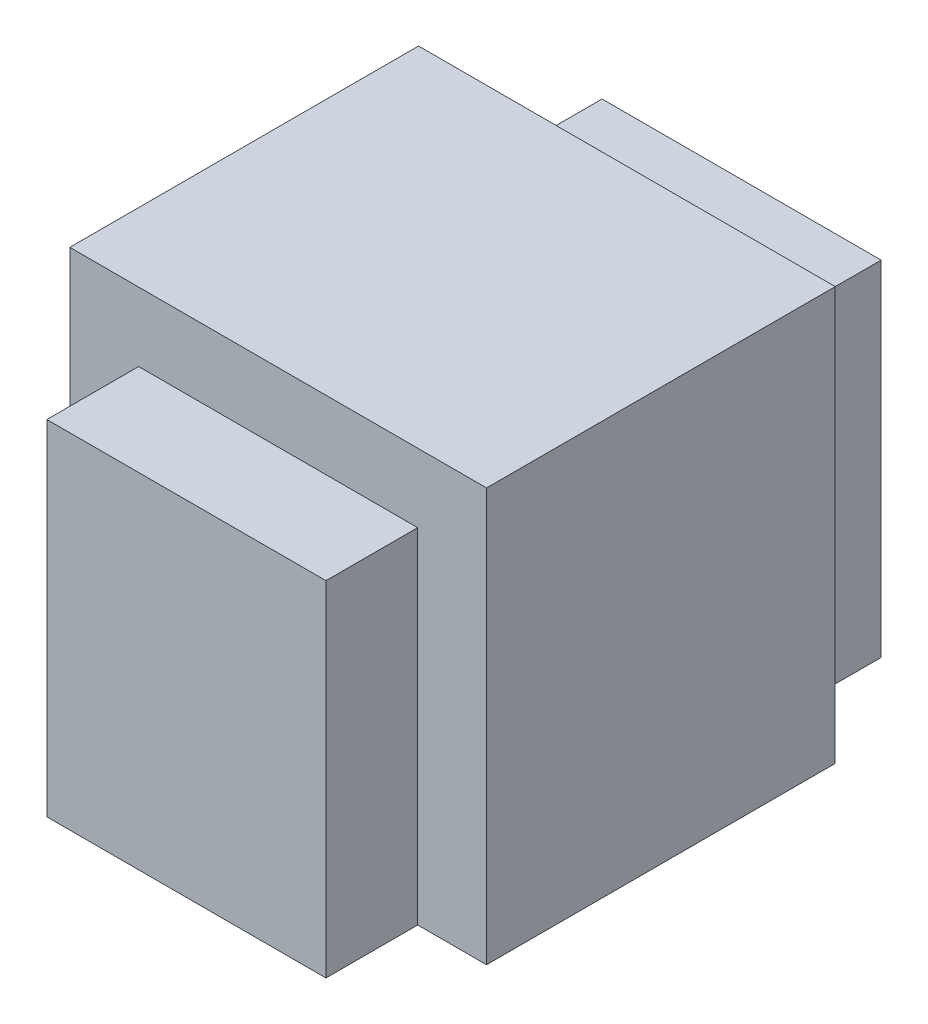
ISO-10303-21;
HEADER;
FILE_DESCRIPTION(('STEP AP214'),'2;1');
FILE_NAME('part.step','',(''),(''),'','','');
FILE_SCHEMA(('AUTOMOTIVE_DESIGN { 1 0 10303 214 1 1 1 1 }'));
ENDSEC;
DATA;
#1=APPLICATION_CONTEXT('core data for automotive mechanical design processes');
#2=APPLICATION_PROTOCOL_DEFINITION('international standard','automotive_design',2000,#1);
#3=PRODUCT_CONTEXT('',#1,'mechanical');
#4=PRODUCT('Part','Part','',(#3));
#5=PRODUCT_RELATED_PRODUCT_CATEGORY('part','',(#4));
#6=PRODUCT_DEFINITION_FORMATION('','',#4);
#7=PRODUCT_DEFINITION_CONTEXT('part definition',#1,'design');
#8=PRODUCT_DEFINITION('design','',#6,#7);
#9=PRODUCT_DEFINITION_SHAPE('','',#8);
#10=(LENGTH_UNIT() NAMED_UNIT(*) SI_UNIT(.MILLI.,.METRE.));
#11=(NAMED_UNIT(*) PLANE_ANGLE_UNIT() SI_UNIT($,.RADIAN.));
#12=(NAMED_UNIT(*) SI_UNIT($,.STERADIAN.) SOLID_ANGLE_UNIT());
#13=UNCERTAINTY_MEASURE_WITH_UNIT(LENGTH_MEASURE(1.E-05),#10,'distance_accuracy_value','');
#14=(GEOMETRIC_REPRESENTATION_CONTEXT(3) GLOBAL_UNCERTAINTY_ASSIGNED_CONTEXT((#13)) GLOBAL_UNIT_ASSIGNED_CONTEXT((#10,
#11,#12)) REPRESENTATION_CONTEXT('',''));
#15=CARTESIAN_POINT('',(0.,0.,0.));
#16=DIRECTION('',(0.,0.,1.));
#17=DIRECTION('',(1.,0.,0.));
#18=AXIS2_PLACEMENT_3D('',#15,#16,#17);
#19=CARTESIAN_POINT('',(0.,0.,76.));
#20=DIRECTION('',(0.,0.,-1.));
#21=DIRECTION('',(-1.,0.,0.));
#22=AXIS2_PLACEMENT_3D('',#19,#20,#21);
#23=PLANE('',#22);
#24=DIRECTION('',(0.,-1.,0.));
#25=VECTOR('',#24,1.);
#26=CARTESIAN_POINT('',(15.,0.,76.));
#27=LINE('',#26,#25);
#28=CARTESIAN_POINT('',(15.,75.,76.));
#29=VERTEX_POINT('',#28);
#30=CARTESIAN_POINT('',(15.,0.,76.));
#31=VERTEX_POINT('',#30);
#32=EDGE_CURVE('E143',#29,#31,#27,.T.);
#33=ORIENTED_EDGE('',*,*,#32,.F.);
#34=DIRECTION('',(-1.,0.,0.));
#35=VECTOR('',#34,1.);
#36=CARTESIAN_POINT('',(15.,75.,76.));
#37=LINE('',#36,#35);
#38=CARTESIAN_POINT('',(75.825,75.,76.));
#39=VERTEX_POINT('',#38);
#40=EDGE_CURVE('E156',#39,#29,#37,.T.);
#41=ORIENTED_EDGE('',*,*,#40,.F.);
#42=DIRECTION('',(0.,1.,0.));
#43=VECTOR('',#42,1.);
#44=CARTESIAN_POINT('',(75.825,0.,76.));
#45=LINE('',#44,#43);
#46=CARTESIAN_POINT('',(75.825,0.,76.));
#47=VERTEX_POINT('',#46);
#48=EDGE_CURVE('E146',#47,#39,#45,.T.);
#49=ORIENTED_EDGE('',*,*,#48,.F.);
#50=DIRECTION('',(1.,0.,0.));
#51=VECTOR('',#50,1.);
#52=CARTESIAN_POINT('',(0.,0.,76.));
#53=LINE('',#52,#51);
#54=CARTESIAN_POINT('',(90.825,0.,76.));
#55=VERTEX_POINT('',#54);
#56=EDGE_CURVE('E182',#47,#55,#53,.T.);
#57=ORIENTED_EDGE('',*,*,#56,.T.);
#58=DIRECTION('',(0.,1.,0.));
#59=VECTOR('',#58,1.);
#60=CARTESIAN_POINT('',(90.825,0.,76.));
#61=LINE('',#60,#59);
#62=CARTESIAN_POINT('',(90.825,90.,76.));
#63=VERTEX_POINT('',#62);
#64=EDGE_CURVE('E186',#55,#63,#61,.T.);
#65=ORIENTED_EDGE('',*,*,#64,.T.);
#66=DIRECTION('',(-1.,0.,0.));
#67=VECTOR('',#66,1.);
#68=CARTESIAN_POINT('',(0.,90.,76.));
#69=LINE('',#68,#67);
#70=CARTESIAN_POINT('',(0.,90.,76.));
#71=VERTEX_POINT('',#70);
#72=EDGE_CURVE('E188',#63,#71,#69,.T.);
#73=ORIENTED_EDGE('',*,*,#72,.T.);
#74=DIRECTION('',(0.,-1.,0.));
#75=VECTOR('',#74,1.);
#76=CARTESIAN_POINT('',(0.,0.,76.));
#77=LINE('',#76,#75);
#78=CARTESIAN_POINT('',(0.,0.,76.));
#79=VERTEX_POINT('',#78);
#80=EDGE_CURVE('E179',#71,#79,#77,.T.);
#81=ORIENTED_EDGE('',*,*,#80,.T.);
#82=EDGE_CURVE('E184',#79,#31,#53,.T.);
#83=ORIENTED_EDGE('',*,*,#82,.T.);
#84=EDGE_LOOP('',(#33,#41,#49,#57,#65,#73,#81,#83));
#85=FACE_BOUND('',#84,.T.);
#86=ADVANCED_FACE('F34',(#85),#23,.F.);
#87=CARTESIAN_POINT('',(0.,0.,76.));
#88=DIRECTION('',(1.,0.,0.));
#89=DIRECTION('',(0.,0.,-1.));
#90=AXIS2_PLACEMENT_3D('',#87,#88,#89);
#91=PLANE('',#90);
#92=DIRECTION('',(0.,-1.,0.));
#93=VECTOR('',#92,1.);
#94=CARTESIAN_POINT('',(0.,0.,0.));
#95=LINE('',#94,#93);
#96=CARTESIAN_POINT('',(0.,90.,0.));
#97=VERTEX_POINT('',#96);
#98=CARTESIAN_POINT('',(0.,0.,0.));
#99=VERTEX_POINT('',#98);
#100=EDGE_CURVE('E178',#97,#99,#95,.T.);
#101=ORIENTED_EDGE('',*,*,#100,.T.);
#102=DIRECTION('',(0.,0.,-1.));
#103=VECTOR('',#102,1.);
#104=CARTESIAN_POINT('',(0.,0.,76.));
#105=LINE('',#104,#103);
#106=EDGE_CURVE('E11',#79,#99,#105,.T.);
#107=ORIENTED_EDGE('',*,*,#106,.F.);
#108=ORIENTED_EDGE('',*,*,#80,.F.);
#109=DIRECTION('',(0.,0.,-1.));
#110=VECTOR('',#109,1.);
#111=CARTESIAN_POINT('',(0.,90.,76.));
#112=LINE('',#111,#110);
#113=EDGE_CURVE('E190',#71,#97,#112,.T.);
#114=ORIENTED_EDGE('',*,*,#113,.T.);
#115=EDGE_LOOP('',(#101,#107,#108,#114));
#116=FACE_BOUND('',#115,.T.);
#117=ADVANCED_FACE('F36',(#116),#91,.F.);
#118=CARTESIAN_POINT('',(0.,0.,76.));
#119=DIRECTION('',(0.,1.,0.));
#120=DIRECTION('',(0.,0.,1.));
#121=AXIS2_PLACEMENT_3D('',#118,#119,#120);
#122=PLANE('',#121);
#123=DIRECTION('',(1.,0.,0.));
#124=VECTOR('',#123,1.);
#125=CARTESIAN_POINT('',(0.,0.,0.));
#126=LINE('',#125,#124);
#127=CARTESIAN_POINT('',(15.,0.,0.));
#128=VERTEX_POINT('',#127);
#129=EDGE_CURVE('E194',#99,#128,#126,.T.);
#130=ORIENTED_EDGE('',*,*,#129,.T.);
#131=DIRECTION('',(0.,0.,1.));
#132=VECTOR('',#131,1.);
#133=CARTESIAN_POINT('',(15.,0.,-25.));
#134=LINE('',#133,#132);
#135=CARTESIAN_POINT('',(15.,0.,-25.));
#136=VERTEX_POINT('',#135);
#137=EDGE_CURVE('E148',#136,#128,#134,.T.);
#138=ORIENTED_EDGE('',*,*,#137,.F.);
#139=DIRECTION('',(-1.,0.,0.));
#140=VECTOR('',#139,1.);
#141=CARTESIAN_POINT('',(75.825,0.,-25.));
#142=LINE('',#141,#140);
#143=CARTESIAN_POINT('',(75.825,0.,-25.));
#144=VERTEX_POINT('',#143);
#145=EDGE_CURVE('E130',#144,#136,#142,.T.);
#146=ORIENTED_EDGE('',*,*,#145,.F.);
#147=DIRECTION('',(0.,0.,1.));
#148=VECTOR('',#147,1.);
#149=CARTESIAN_POINT('',(75.825,0.,-25.));
#150=LINE('',#149,#148);
#151=CARTESIAN_POINT('',(75.825,0.,0.));
#152=VERTEX_POINT('',#151);
#153=EDGE_CURVE('E127',#144,#152,#150,.T.);
#154=ORIENTED_EDGE('',*,*,#153,.T.);
#155=CARTESIAN_POINT('',(90.825,0.,0.));
#156=VERTEX_POINT('',#155);
#157=EDGE_CURVE('E193',#152,#156,#126,.T.);
#158=ORIENTED_EDGE('',*,*,#157,.T.);
#159=DIRECTION('',(0.,0.,-1.));
#160=VECTOR('',#159,1.);
#161=CARTESIAN_POINT('',(90.825,0.,76.));
#162=LINE('',#161,#160);
#163=EDGE_CURVE('E42',#55,#156,#162,.T.);
#164=ORIENTED_EDGE('',*,*,#163,.F.);
#165=ORIENTED_EDGE('',*,*,#56,.F.);
#166=DIRECTION('',(0.,0.,-1.));
#167=VECTOR('',#166,1.);
#168=CARTESIAN_POINT('',(75.825,0.,96.));
#169=LINE('',#168,#167);
#170=CARTESIAN_POINT('',(75.825,0.,96.));
#171=VERTEX_POINT('',#170);
#172=EDGE_CURVE('E172',#171,#47,#169,.T.);
#173=ORIENTED_EDGE('',*,*,#172,.F.);
#174=DIRECTION('',(1.,0.,0.));
#175=VECTOR('',#174,1.);
#176=CARTESIAN_POINT('',(15.,0.,96.));
#177=LINE('',#176,#175);
#178=CARTESIAN_POINT('',(15.,0.,96.));
#179=VERTEX_POINT('',#178);
#180=EDGE_CURVE('E155',#179,#171,#177,.T.);
#181=ORIENTED_EDGE('',*,*,#180,.F.);
#182=DIRECTION('',(0.,0.,-1.));
#183=VECTOR('',#182,1.);
#184=CARTESIAN_POINT('',(15.,0.,96.));
#185=LINE('',#184,#183);
#186=EDGE_CURVE('E175',#179,#31,#185,.T.);
#187=ORIENTED_EDGE('',*,*,#186,.T.);
#188=ORIENTED_EDGE('',*,*,#82,.F.);
#189=ORIENTED_EDGE('',*,*,#106,.T.);
#190=EDGE_LOOP('',(#130,#138,#146,#154,#158,#164,#165,#173,#181,#187,#188,#189));
#191=FACE_BOUND('',#190,.T.);
#192=ADVANCED_FACE('F225',(#191),#122,.F.);
#193=CARTESIAN_POINT('',(90.825,0.,76.));
#194=DIRECTION('',(-1.,0.,0.));
#195=DIRECTION('',(0.,0.,1.));
#196=AXIS2_PLACEMENT_3D('',#193,#194,#195);
#197=PLANE('',#196);
#198=DIRECTION('',(0.,1.,0.));
#199=VECTOR('',#198,1.);
#200=CARTESIAN_POINT('',(90.825,0.,0.));
#201=LINE('',#200,#199);
#202=CARTESIAN_POINT('',(90.825,90.,0.));
#203=VERTEX_POINT('',#202);
#204=EDGE_CURVE('E197',#156,#203,#201,.T.);
#205=ORIENTED_EDGE('',*,*,#204,.T.);
#206=DIRECTION('',(0.,0.,-1.));
#207=VECTOR('',#206,1.);
#208=CARTESIAN_POINT('',(90.825,90.,76.));
#209=LINE('',#208,#207);
#210=EDGE_CURVE('E202',#63,#203,#209,.T.);
#211=ORIENTED_EDGE('',*,*,#210,.F.);
#212=ORIENTED_EDGE('',*,*,#64,.F.);
#213=ORIENTED_EDGE('',*,*,#163,.T.);
#214=EDGE_LOOP('',(#205,#211,#212,#213));
#215=FACE_BOUND('',#214,.T.);
#216=ADVANCED_FACE('F209',(#215),#197,.F.);
#217=CARTESIAN_POINT('',(0.,90.,76.));
#218=DIRECTION('',(0.,-1.,0.));
#219=DIRECTION('',(0.,0.,-1.));
#220=AXIS2_PLACEMENT_3D('',#217,#218,#219);
#221=PLANE('',#220);
#222=DIRECTION('',(-1.,0.,0.));
#223=VECTOR('',#222,1.);
#224=CARTESIAN_POINT('',(0.,90.,0.));
#225=LINE('',#224,#223);
#226=EDGE_CURVE('E183',#203,#97,#225,.T.);
#227=ORIENTED_EDGE('',*,*,#226,.T.);
#228=ORIENTED_EDGE('',*,*,#113,.F.);
#229=ORIENTED_EDGE('',*,*,#72,.F.);
#230=ORIENTED_EDGE('',*,*,#210,.T.);
#231=EDGE_LOOP('',(#227,#228,#229,#230));
#232=FACE_BOUND('',#231,.T.);
#233=ADVANCED_FACE('F218',(#232),#221,.F.);
#234=CARTESIAN_POINT('',(0.,0.,0.));
#235=DIRECTION('',(0.,0.,-1.));
#236=DIRECTION('',(-1.,0.,0.));
#237=AXIS2_PLACEMENT_3D('',#234,#235,#236);
#238=PLANE('',#237);
#239=DIRECTION('',(0.,1.,0.));
#240=VECTOR('',#239,1.);
#241=CARTESIAN_POINT('',(15.,0.,0.));
#242=LINE('',#241,#240);
#243=CARTESIAN_POINT('',(15.,75.,0.));
#244=VERTEX_POINT('',#243);
#245=EDGE_CURVE('E140',#128,#244,#242,.T.);
#246=ORIENTED_EDGE('',*,*,#245,.F.);
#247=ORIENTED_EDGE('',*,*,#129,.F.);
#248=ORIENTED_EDGE('',*,*,#100,.F.);
#249=ORIENTED_EDGE('',*,*,#226,.F.);
#250=ORIENTED_EDGE('',*,*,#204,.F.);
#251=ORIENTED_EDGE('',*,*,#157,.F.);
#252=DIRECTION('',(0.,-1.,0.));
#253=VECTOR('',#252,1.);
#254=CARTESIAN_POINT('',(75.825,75.,0.));
#255=LINE('',#254,#253);
#256=CARTESIAN_POINT('',(75.825,75.,0.));
#257=VERTEX_POINT('',#256);
#258=EDGE_CURVE('E54',#257,#152,#255,.T.);
#259=ORIENTED_EDGE('',*,*,#258,.F.);
#260=DIRECTION('',(1.,0.,0.));
#261=VECTOR('',#260,1.);
#262=CARTESIAN_POINT('',(15.,75.,0.));
#263=LINE('',#262,#261);
#264=EDGE_CURVE('E49',#244,#257,#263,.T.);
#265=ORIENTED_EDGE('',*,*,#264,.F.);
#266=EDGE_LOOP('',(#246,#247,#248,#249,#250,#251,#259,#265));
#267=FACE_BOUND('',#266,.T.);
#268=ADVANCED_FACE('F214',(#267),#238,.T.);
#269=CARTESIAN_POINT('',(15.,0.,96.));
#270=DIRECTION('',(1.,0.,0.));
#271=DIRECTION('',(0.,0.,-1.));
#272=AXIS2_PLACEMENT_3D('',#269,#270,#271);
#273=PLANE('',#272);
#274=ORIENTED_EDGE('',*,*,#32,.T.);
#275=ORIENTED_EDGE('',*,*,#186,.F.);
#276=DIRECTION('',(0.,-1.,0.));
#277=VECTOR('',#276,1.);
#278=CARTESIAN_POINT('',(15.,0.,96.));
#279=LINE('',#278,#277);
#280=CARTESIAN_POINT('',(15.,75.,96.));
#281=VERTEX_POINT('',#280);
#282=EDGE_CURVE('E152',#281,#179,#279,.T.);
#283=ORIENTED_EDGE('',*,*,#282,.F.);
#284=DIRECTION('',(0.,0.,-1.));
#285=VECTOR('',#284,1.);
#286=CARTESIAN_POINT('',(15.,75.,96.));
#287=LINE('',#286,#285);
#288=EDGE_CURVE('E161',#281,#29,#287,.T.);
#289=ORIENTED_EDGE('',*,*,#288,.T.);
#290=EDGE_LOOP('',(#274,#275,#283,#289));
#291=FACE_BOUND('',#290,.T.);
#292=ADVANCED_FACE('F237',(#291),#273,.F.);
#293=CARTESIAN_POINT('',(75.825,0.,96.));
#294=DIRECTION('',(-1.,0.,0.));
#295=DIRECTION('',(0.,0.,1.));
#296=AXIS2_PLACEMENT_3D('',#293,#294,#295);
#297=PLANE('',#296);
#298=ORIENTED_EDGE('',*,*,#48,.T.);
#299=DIRECTION('',(0.,0.,-1.));
#300=VECTOR('',#299,1.);
#301=CARTESIAN_POINT('',(75.825,75.,96.));
#302=LINE('',#301,#300);
#303=CARTESIAN_POINT('',(75.825,75.,96.));
#304=VERTEX_POINT('',#303);
#305=EDGE_CURVE('E169',#304,#39,#302,.T.);
#306=ORIENTED_EDGE('',*,*,#305,.F.);
#307=DIRECTION('',(0.,1.,0.));
#308=VECTOR('',#307,1.);
#309=CARTESIAN_POINT('',(75.825,0.,96.));
#310=LINE('',#309,#308);
#311=EDGE_CURVE('E158',#171,#304,#310,.T.);
#312=ORIENTED_EDGE('',*,*,#311,.F.);
#313=ORIENTED_EDGE('',*,*,#172,.T.);
#314=EDGE_LOOP('',(#298,#306,#312,#313));
#315=FACE_BOUND('',#314,.T.);
#316=ADVANCED_FACE('F228',(#315),#297,.F.);
#317=CARTESIAN_POINT('',(15.,75.,96.));
#318=DIRECTION('',(0.,-1.,0.));
#319=DIRECTION('',(0.,0.,-1.));
#320=AXIS2_PLACEMENT_3D('',#317,#318,#319);
#321=PLANE('',#320);
#322=ORIENTED_EDGE('',*,*,#40,.T.);
#323=ORIENTED_EDGE('',*,*,#288,.F.);
#324=DIRECTION('',(-1.,0.,0.));
#325=VECTOR('',#324,1.);
#326=CARTESIAN_POINT('',(15.,75.,96.));
#327=LINE('',#326,#325);
#328=EDGE_CURVE('E160',#304,#281,#327,.T.);
#329=ORIENTED_EDGE('',*,*,#328,.F.);
#330=ORIENTED_EDGE('',*,*,#305,.T.);
#331=EDGE_LOOP('',(#322,#323,#329,#330));
#332=FACE_BOUND('',#331,.T.);
#333=ADVANCED_FACE('F239',(#332),#321,.F.);
#334=CARTESIAN_POINT('',(0.,0.,96.));
#335=DIRECTION('',(0.,0.,-1.));
#336=DIRECTION('',(-1.,0.,0.));
#337=AXIS2_PLACEMENT_3D('',#334,#335,#336);
#338=PLANE('',#337);
#339=ORIENTED_EDGE('',*,*,#282,.T.);
#340=ORIENTED_EDGE('',*,*,#180,.T.);
#341=ORIENTED_EDGE('',*,*,#311,.T.);
#342=ORIENTED_EDGE('',*,*,#328,.T.);
#343=EDGE_LOOP('',(#339,#340,#341,#342));
#344=FACE_BOUND('',#343,.T.);
#345=ADVANCED_FACE('F232',(#344),#338,.F.);
#346=CARTESIAN_POINT('',(15.,75.,-25.));
#347=DIRECTION('',(0.,-1.,0.));
#348=DIRECTION('',(0.,0.,-1.));
#349=AXIS2_PLACEMENT_3D('',#346,#347,#348);
#350=PLANE('',#349);
#351=ORIENTED_EDGE('',*,*,#264,.T.);
#352=DIRECTION('',(0.,0.,1.));
#353=VECTOR('',#352,1.);
#354=CARTESIAN_POINT('',(75.825,75.,-25.));
#355=LINE('',#354,#353);
#356=CARTESIAN_POINT('',(75.825,75.,-25.));
#357=VERTEX_POINT('',#356);
#358=EDGE_CURVE('E125',#357,#257,#355,.T.);
#359=ORIENTED_EDGE('',*,*,#358,.F.);
#360=DIRECTION('',(1.,0.,0.));
#361=VECTOR('',#360,1.);
#362=CARTESIAN_POINT('',(15.,75.,-25.));
#363=LINE('',#362,#361);
#364=CARTESIAN_POINT('',(15.,75.,-25.));
#365=VERTEX_POINT('',#364);
#366=EDGE_CURVE('E131',#365,#357,#363,.T.);
#367=ORIENTED_EDGE('',*,*,#366,.F.);
#368=DIRECTION('',(0.,0.,1.));
#369=VECTOR('',#368,1.);
#370=CARTESIAN_POINT('',(15.,75.,-25.));
#371=LINE('',#370,#369);
#372=EDGE_CURVE('E359',#365,#244,#371,.T.);
#373=ORIENTED_EDGE('',*,*,#372,.T.);
#374=EDGE_LOOP('',(#351,#359,#367,#373));
#375=FACE_BOUND('',#374,.T.);
#376=ADVANCED_FACE('F142',(#375),#350,.F.);
#377=CARTESIAN_POINT('',(75.825,75.,-25.));
#378=DIRECTION('',(-1.,0.,0.));
#379=DIRECTION('',(0.,0.,1.));
#380=AXIS2_PLACEMENT_3D('',#377,#378,#379);
#381=PLANE('',#380);
#382=ORIENTED_EDGE('',*,*,#258,.T.);
#383=ORIENTED_EDGE('',*,*,#153,.F.);
#384=DIRECTION('',(0.,-1.,0.));
#385=VECTOR('',#384,1.);
#386=CARTESIAN_POINT('',(75.825,75.,-25.));
#387=LINE('',#386,#385);
#388=EDGE_CURVE('E121',#357,#144,#387,.T.);
#389=ORIENTED_EDGE('',*,*,#388,.F.);
#390=ORIENTED_EDGE('',*,*,#358,.T.);
#391=EDGE_LOOP('',(#382,#383,#389,#390));
#392=FACE_BOUND('',#391,.T.);
#393=ADVANCED_FACE('F123',(#392),#381,.F.);
#394=CARTESIAN_POINT('',(15.,0.,-25.));
#395=DIRECTION('',(1.,0.,0.));
#396=DIRECTION('',(0.,0.,-1.));
#397=AXIS2_PLACEMENT_3D('',#394,#395,#396);
#398=PLANE('',#397);
#399=ORIENTED_EDGE('',*,*,#245,.T.);
#400=ORIENTED_EDGE('',*,*,#372,.F.);
#401=DIRECTION('',(0.,1.,0.));
#402=VECTOR('',#401,1.);
#403=CARTESIAN_POINT('',(15.,0.,-25.));
#404=LINE('',#403,#402);
#405=EDGE_CURVE('E136',#136,#365,#404,.T.);
#406=ORIENTED_EDGE('',*,*,#405,.F.);
#407=ORIENTED_EDGE('',*,*,#137,.T.);
#408=EDGE_LOOP('',(#399,#400,#406,#407));
#409=FACE_BOUND('',#408,.T.);
#410=ADVANCED_FACE('F310',(#409),#398,.F.);
#411=CARTESIAN_POINT('',(0.,0.,-25.));
#412=DIRECTION('',(0.,0.,-1.));
#413=DIRECTION('',(-1.,0.,0.));
#414=AXIS2_PLACEMENT_3D('',#411,#412,#413);
#415=PLANE('',#414);
#416=ORIENTED_EDGE('',*,*,#366,.T.);
#417=ORIENTED_EDGE('',*,*,#388,.T.);
#418=ORIENTED_EDGE('',*,*,#145,.T.);
#419=ORIENTED_EDGE('',*,*,#405,.T.);
#420=EDGE_LOOP('',(#416,#417,#418,#419));
#421=FACE_BOUND('',#420,.T.);
#422=ADVANCED_FACE('F134',(#421),#415,.T.);
#423=CLOSED_SHELL('',(#86,#117,#192,#216,#233,#268,#292,#316,#333,#345,#376,#393,#410,#422));
#424=MANIFOLD_SOLID_BREP('B2',#423);
#425=ADVANCED_BREP_SHAPE_REPRESENTATION('',(#18,#424),#14);
#426=SHAPE_DEFINITION_REPRESENTATION(#9,#425);
ENDSEC;
END-ISO-10303-21;
